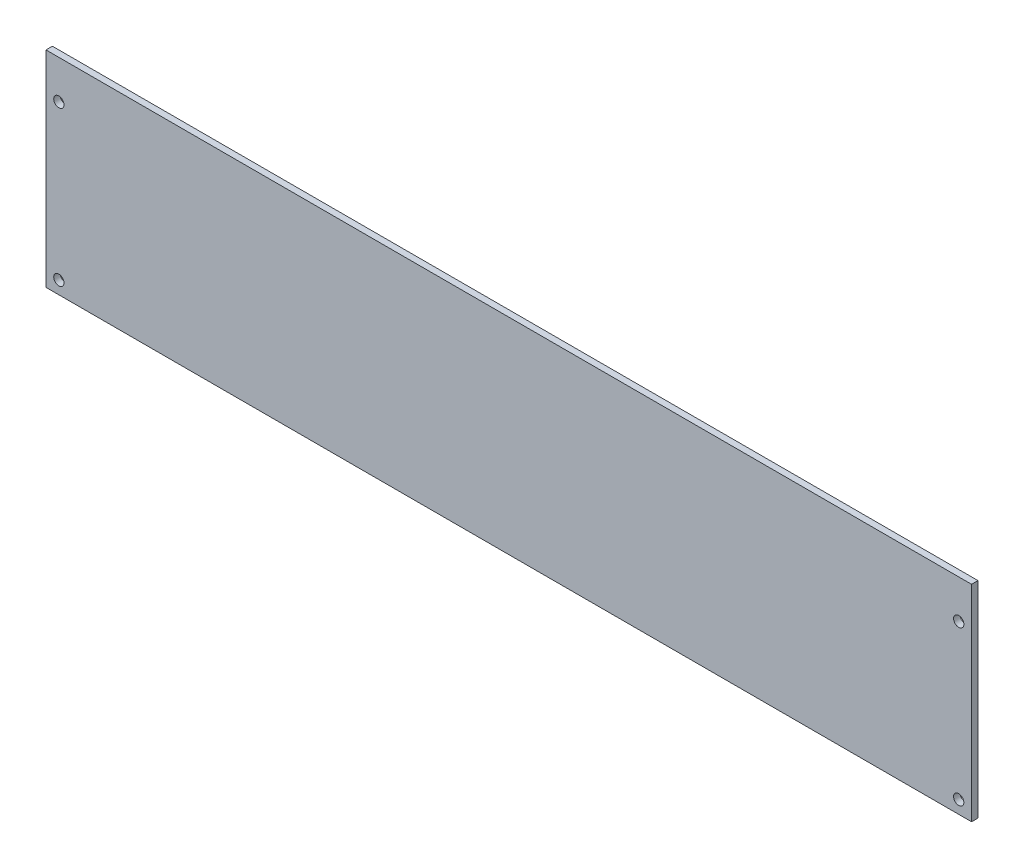
ISO-10303-21;
HEADER;
FILE_DESCRIPTION(('STEP AP214'),'2;1');
FILE_NAME('part.step','',(''),(''),'','','');
FILE_SCHEMA(('AUTOMOTIVE_DESIGN { 1 0 10303 214 1 1 1 1 }'));
ENDSEC;
DATA;
#1=APPLICATION_CONTEXT('core data for automotive mechanical design processes');
#2=APPLICATION_PROTOCOL_DEFINITION('international standard','automotive_design',2000,#1);
#3=PRODUCT_CONTEXT('',#1,'mechanical');
#4=PRODUCT('Part','Part','',(#3));
#5=PRODUCT_RELATED_PRODUCT_CATEGORY('part','',(#4));
#6=PRODUCT_DEFINITION_FORMATION('','',#4);
#7=PRODUCT_DEFINITION_CONTEXT('part definition',#1,'design');
#8=PRODUCT_DEFINITION('design','',#6,#7);
#9=PRODUCT_DEFINITION_SHAPE('','',#8);
#10=(LENGTH_UNIT() NAMED_UNIT(*) SI_UNIT(.MILLI.,.METRE.));
#11=(NAMED_UNIT(*) PLANE_ANGLE_UNIT() SI_UNIT($,.RADIAN.));
#12=(NAMED_UNIT(*) SI_UNIT($,.STERADIAN.) SOLID_ANGLE_UNIT());
#13=UNCERTAINTY_MEASURE_WITH_UNIT(LENGTH_MEASURE(1.E-05),#10,'distance_accuracy_value','');
#14=(GEOMETRIC_REPRESENTATION_CONTEXT(3) GLOBAL_UNCERTAINTY_ASSIGNED_CONTEXT((#13)) GLOBAL_UNIT_ASSIGNED_CONTEXT((#10,
#11,#12)) REPRESENTATION_CONTEXT('',''));
#15=CARTESIAN_POINT('',(0.,0.,0.));
#16=DIRECTION('',(0.,0.,1.));
#17=DIRECTION('',(1.,0.,0.));
#18=AXIS2_PLACEMENT_3D('',#15,#16,#17);
#19=CARTESIAN_POINT('',(-381.526970954357,85.3319397027155,-3.175));
#20=DIRECTION('',(-1.,0.,0.));
#21=DIRECTION('',(0.,0.,1.));
#22=AXIS2_PLACEMENT_3D('',#19,#20,#21);
#23=PLANE('',#22);
#24=DIRECTION('',(0.,-1.,0.));
#25=VECTOR('',#24,1.);
#26=CARTESIAN_POINT('',(-381.526970954357,85.3319397027155,0.));
#27=LINE('',#26,#25);
#28=CARTESIAN_POINT('',(-381.526970954357,85.3319397027155,0.));
#29=VERTEX_POINT('',#28);
#30=CARTESIAN_POINT('',(-381.526970954357,-16.2680602972845,0.));
#31=VERTEX_POINT('',#30);
#32=EDGE_CURVE('E98',#29,#31,#27,.T.);
#33=ORIENTED_EDGE('',*,*,#32,.F.);
#34=DIRECTION('',(0.,0.,1.));
#35=VECTOR('',#34,1.);
#36=CARTESIAN_POINT('',(-381.526970954357,85.3319397027155,-3.175));
#37=LINE('',#36,#35);
#38=CARTESIAN_POINT('',(-381.526970954357,85.3319397027155,-3.175));
#39=VERTEX_POINT('',#38);
#40=EDGE_CURVE('E11',#39,#29,#37,.T.);
#41=ORIENTED_EDGE('',*,*,#40,.F.);
#42=DIRECTION('',(0.,-1.,0.));
#43=VECTOR('',#42,1.);
#44=CARTESIAN_POINT('',(-381.526970954357,85.3319397027155,-3.175));
#45=LINE('',#44,#43);
#46=CARTESIAN_POINT('',(-381.526970954357,-16.2680602972845,-3.175));
#47=VERTEX_POINT('',#46);
#48=EDGE_CURVE('E91',#39,#47,#45,.T.);
#49=ORIENTED_EDGE('',*,*,#48,.T.);
#50=DIRECTION('',(0.,0.,1.));
#51=VECTOR('',#50,1.);
#52=CARTESIAN_POINT('',(-381.526970954357,-16.2680602972845,-3.175));
#53=LINE('',#52,#51);
#54=EDGE_CURVE('E36',#47,#31,#53,.T.);
#55=ORIENTED_EDGE('',*,*,#54,.T.);
#56=EDGE_LOOP('',(#33,#41,#49,#55));
#57=FACE_BOUND('',#56,.T.);
#58=ADVANCED_FACE('F33',(#57),#23,.T.);
#59=CARTESIAN_POINT('',(-381.526970954357,85.3319397027155,-3.175));
#60=DIRECTION('',(0.,1.,0.));
#61=DIRECTION('',(0.,0.,1.));
#62=AXIS2_PLACEMENT_3D('',#59,#60,#61);
#63=PLANE('',#62);
#64=DIRECTION('',(-1.,0.,0.));
#65=VECTOR('',#64,1.);
#66=CARTESIAN_POINT('',(-381.526970954357,85.3319397027155,0.));
#67=LINE('',#66,#65);
#68=CARTESIAN_POINT('',(75.6730290456432,85.3319397027155,0.));
#69=VERTEX_POINT('',#68);
#70=EDGE_CURVE('E93',#69,#29,#67,.T.);
#71=ORIENTED_EDGE('',*,*,#70,.F.);
#72=DIRECTION('',(0.,0.,1.));
#73=VECTOR('',#72,1.);
#74=CARTESIAN_POINT('',(75.6730290456432,85.3319397027155,-3.175));
#75=LINE('',#74,#73);
#76=CARTESIAN_POINT('',(75.6730290456432,85.3319397027155,-3.175));
#77=VERTEX_POINT('',#76);
#78=EDGE_CURVE('E42',#77,#69,#75,.T.);
#79=ORIENTED_EDGE('',*,*,#78,.F.);
#80=DIRECTION('',(-1.,0.,0.));
#81=VECTOR('',#80,1.);
#82=CARTESIAN_POINT('',(-381.526970954357,85.3319397027155,-3.175));
#83=LINE('',#82,#81);
#84=EDGE_CURVE('E88',#77,#39,#83,.T.);
#85=ORIENTED_EDGE('',*,*,#84,.T.);
#86=ORIENTED_EDGE('',*,*,#40,.T.);
#87=EDGE_LOOP('',(#71,#79,#85,#86));
#88=FACE_BOUND('',#87,.T.);
#89=ADVANCED_FACE('F109',(#88),#63,.T.);
#90=CARTESIAN_POINT('',(75.6730290456432,85.3319397027155,-3.175));
#91=DIRECTION('',(1.,0.,0.));
#92=DIRECTION('',(0.,1.,0.));
#93=AXIS2_PLACEMENT_3D('',#90,#91,#92);
#94=PLANE('',#93);
#95=DIRECTION('',(0.,1.,0.));
#96=VECTOR('',#95,1.);
#97=CARTESIAN_POINT('',(75.6730290456432,85.3319397027155,0.));
#98=LINE('',#97,#96);
#99=CARTESIAN_POINT('',(75.6730290456432,-16.2680602972845,0.));
#100=VERTEX_POINT('',#99);
#101=EDGE_CURVE('E83',#100,#69,#98,.T.);
#102=ORIENTED_EDGE('',*,*,#101,.F.);
#103=DIRECTION('',(0.,0.,1.));
#104=VECTOR('',#103,1.);
#105=CARTESIAN_POINT('',(75.6730290456432,-16.2680602972845,-3.175));
#106=LINE('',#105,#104);
#107=CARTESIAN_POINT('',(75.6730290456432,-16.2680602972845,-3.175));
#108=VERTEX_POINT('',#107);
#109=EDGE_CURVE('E78',#108,#100,#106,.T.);
#110=ORIENTED_EDGE('',*,*,#109,.F.);
#111=DIRECTION('',(0.,1.,0.));
#112=VECTOR('',#111,1.);
#113=CARTESIAN_POINT('',(75.6730290456432,85.3319397027155,-3.175));
#114=LINE('',#113,#112);
#115=EDGE_CURVE('E81',#108,#77,#114,.T.);
#116=ORIENTED_EDGE('',*,*,#115,.T.);
#117=ORIENTED_EDGE('',*,*,#78,.T.);
#118=EDGE_LOOP('',(#102,#110,#116,#117));
#119=FACE_BOUND('',#118,.T.);
#120=ADVANCED_FACE('F80',(#119),#94,.T.);
#121=CARTESIAN_POINT('',(-381.526970954357,-16.2680602972845,-3.175));
#122=DIRECTION('',(0.,-1.,0.));
#123=DIRECTION('',(0.,0.,-1.));
#124=AXIS2_PLACEMENT_3D('',#121,#122,#123);
#125=PLANE('',#124);
#126=DIRECTION('',(1.,0.,0.));
#127=VECTOR('',#126,1.);
#128=CARTESIAN_POINT('',(-381.526970954357,-16.2680602972845,0.));
#129=LINE('',#128,#127);
#130=EDGE_CURVE('E101',#31,#100,#129,.T.);
#131=ORIENTED_EDGE('',*,*,#130,.F.);
#132=ORIENTED_EDGE('',*,*,#54,.F.);
#133=DIRECTION('',(1.,0.,0.));
#134=VECTOR('',#133,1.);
#135=CARTESIAN_POINT('',(-381.526970954357,-16.2680602972845,-3.175));
#136=LINE('',#135,#134);
#137=EDGE_CURVE('E87',#47,#108,#136,.T.);
#138=ORIENTED_EDGE('',*,*,#137,.T.);
#139=ORIENTED_EDGE('',*,*,#109,.T.);
#140=EDGE_LOOP('',(#131,#132,#138,#139));
#141=FACE_BOUND('',#140,.T.);
#142=ADVANCED_FACE('F90',(#141),#125,.T.);
#143=CARTESIAN_POINT('',(-381.526970954357,-16.2680602972845,-3.175));
#144=DIRECTION('',(0.,0.,1.));
#145=DIRECTION('',(1.,0.,0.));
#146=AXIS2_PLACEMENT_3D('',#143,#144,#145);
#147=PLANE('',#146);
#148=CARTESIAN_POINT('',(69.3230290456432,-9.91806029728452,-3.175));
#149=DIRECTION('',(0.,0.,1.));
#150=DIRECTION('',(1.,0.,0.));
#151=AXIS2_PLACEMENT_3D('',#148,#149,#150);
#152=CIRCLE('',#151,2.54);
#153=CARTESIAN_POINT('',(71.8630290456432,-9.91806029728452,-3.175));
#154=VERTEX_POINT('',#153);
#155=EDGE_CURVE('E150',#154,#154,#152,.T.);
#156=ORIENTED_EDGE('',*,*,#155,.T.);
#157=EDGE_LOOP('',(#156));
#158=FACE_BOUND('',#157,.T.);
#159=CARTESIAN_POINT('',(69.3230290456432,66.2819397027155,-3.175));
#160=DIRECTION('',(0.,0.,1.));
#161=DIRECTION('',(1.,0.,0.));
#162=AXIS2_PLACEMENT_3D('',#159,#160,#161);
#163=CIRCLE('',#162,2.53999999999999);
#164=CARTESIAN_POINT('',(71.8630290456432,66.2819397027155,-3.175));
#165=VERTEX_POINT('',#164);
#166=EDGE_CURVE('E158',#165,#165,#163,.T.);
#167=ORIENTED_EDGE('',*,*,#166,.T.);
#168=EDGE_LOOP('',(#167));
#169=FACE_BOUND('',#168,.T.);
#170=CARTESIAN_POINT('',(-375.176970954357,-9.91806029728452,-3.175));
#171=DIRECTION('',(0.,0.,1.));
#172=DIRECTION('',(1.,0.,0.));
#173=AXIS2_PLACEMENT_3D('',#170,#171,#172);
#174=CIRCLE('',#173,2.54000000000001);
#175=CARTESIAN_POINT('',(-372.636970954357,-9.91806029728452,-3.175));
#176=VERTEX_POINT('',#175);
#177=EDGE_CURVE('E164',#176,#176,#174,.T.);
#178=ORIENTED_EDGE('',*,*,#177,.T.);
#179=EDGE_LOOP('',(#178));
#180=FACE_BOUND('',#179,.T.);
#181=CARTESIAN_POINT('',(-375.176970954357,66.2819397027155,-3.175));
#182=DIRECTION('',(0.,0.,1.));
#183=DIRECTION('',(1.,0.,0.));
#184=AXIS2_PLACEMENT_3D('',#181,#182,#183);
#185=CIRCLE('',#184,2.54000000000001);
#186=CARTESIAN_POINT('',(-372.636970954357,66.2819397027155,-3.175));
#187=VERTEX_POINT('',#186);
#188=EDGE_CURVE('E102',#187,#187,#185,.T.);
#189=ORIENTED_EDGE('',*,*,#188,.T.);
#190=EDGE_LOOP('',(#189));
#191=FACE_BOUND('',#190,.T.);
#192=ORIENTED_EDGE('',*,*,#48,.F.);
#193=ORIENTED_EDGE('',*,*,#84,.F.);
#194=ORIENTED_EDGE('',*,*,#115,.F.);
#195=ORIENTED_EDGE('',*,*,#137,.F.);
#196=EDGE_LOOP('',(#192,#193,#194,#195));
#197=FACE_BOUND('',#196,.T.);
#198=ADVANCED_FACE('F86',(#158,#169,#180,#191,#197),#147,.F.);
#199=CARTESIAN_POINT('',(-381.526970954357,-16.2680602972845,0.));
#200=DIRECTION('',(0.,0.,1.));
#201=DIRECTION('',(1.,0.,0.));
#202=AXIS2_PLACEMENT_3D('',#199,#200,#201);
#203=PLANE('',#202);
#204=CARTESIAN_POINT('',(69.3230290456432,-9.91806029728452,0.));
#205=DIRECTION('',(0.,0.,1.));
#206=DIRECTION('',(1.,0.,0.));
#207=AXIS2_PLACEMENT_3D('',#204,#205,#206);
#208=CIRCLE('',#207,2.54);
#209=CARTESIAN_POINT('',(71.8630290456432,-9.91806029728452,0.));
#210=VERTEX_POINT('',#209);
#211=EDGE_CURVE('E153',#210,#210,#208,.T.);
#212=ORIENTED_EDGE('',*,*,#211,.F.);
#213=EDGE_LOOP('',(#212));
#214=FACE_BOUND('',#213,.T.);
#215=CARTESIAN_POINT('',(69.3230290456432,66.2819397027155,0.));
#216=DIRECTION('',(0.,0.,1.));
#217=DIRECTION('',(1.,0.,0.));
#218=AXIS2_PLACEMENT_3D('',#215,#216,#217);
#219=CIRCLE('',#218,2.53999999999999);
#220=CARTESIAN_POINT('',(71.8630290456432,66.2819397027155,0.));
#221=VERTEX_POINT('',#220);
#222=EDGE_CURVE('E155',#221,#221,#219,.T.);
#223=ORIENTED_EDGE('',*,*,#222,.F.);
#224=EDGE_LOOP('',(#223));
#225=FACE_BOUND('',#224,.T.);
#226=CARTESIAN_POINT('',(-375.176970954357,-9.91806029728452,0.));
#227=DIRECTION('',(0.,0.,1.));
#228=DIRECTION('',(1.,0.,0.));
#229=AXIS2_PLACEMENT_3D('',#226,#227,#228);
#230=CIRCLE('',#229,2.54000000000001);
#231=CARTESIAN_POINT('',(-372.636970954357,-9.91806029728452,0.));
#232=VERTEX_POINT('',#231);
#233=EDGE_CURVE('E161',#232,#232,#230,.T.);
#234=ORIENTED_EDGE('',*,*,#233,.F.);
#235=EDGE_LOOP('',(#234));
#236=FACE_BOUND('',#235,.T.);
#237=CARTESIAN_POINT('',(-375.176970954357,66.2819397027155,0.));
#238=DIRECTION('',(0.,0.,1.));
#239=DIRECTION('',(1.,0.,0.));
#240=AXIS2_PLACEMENT_3D('',#237,#238,#239);
#241=CIRCLE('',#240,2.54000000000001);
#242=CARTESIAN_POINT('',(-372.636970954357,66.2819397027155,0.));
#243=VERTEX_POINT('',#242);
#244=EDGE_CURVE('E167',#243,#243,#241,.T.);
#245=ORIENTED_EDGE('',*,*,#244,.F.);
#246=EDGE_LOOP('',(#245));
#247=FACE_BOUND('',#246,.T.);
#248=ORIENTED_EDGE('',*,*,#32,.T.);
#249=ORIENTED_EDGE('',*,*,#130,.T.);
#250=ORIENTED_EDGE('',*,*,#101,.T.);
#251=ORIENTED_EDGE('',*,*,#70,.T.);
#252=EDGE_LOOP('',(#248,#249,#250,#251));
#253=FACE_BOUND('',#252,.T.);
#254=ADVANCED_FACE('F108',(#214,#225,#236,#247,#253),#203,.T.);
#255=CARTESIAN_POINT('',(-375.176970954357,66.2819397027155,-3.175));
#256=DIRECTION('',(0.,0.,1.));
#257=DIRECTION('',(1.,0.,0.));
#258=AXIS2_PLACEMENT_3D('',#255,#256,#257);
#259=CYLINDRICAL_SURFACE('',#258,2.54000000000001);
#260=ORIENTED_EDGE('',*,*,#188,.F.);
#261=EDGE_LOOP('',(#260));
#262=FACE_BOUND('',#261,.T.);
#263=ORIENTED_EDGE('',*,*,#244,.T.);
#264=EDGE_LOOP('',(#263));
#265=FACE_BOUND('',#264,.T.);
#266=ADVANCED_FACE('F127',(#262,#265),#259,.F.);
#267=CARTESIAN_POINT('',(-375.176970954357,-9.91806029728452,-3.175));
#268=DIRECTION('',(0.,0.,1.));
#269=DIRECTION('',(1.,0.,0.));
#270=AXIS2_PLACEMENT_3D('',#267,#268,#269);
#271=CYLINDRICAL_SURFACE('',#270,2.54000000000001);
#272=ORIENTED_EDGE('',*,*,#177,.F.);
#273=EDGE_LOOP('',(#272));
#274=FACE_BOUND('',#273,.T.);
#275=ORIENTED_EDGE('',*,*,#233,.T.);
#276=EDGE_LOOP('',(#275));
#277=FACE_BOUND('',#276,.T.);
#278=ADVANCED_FACE('F134',(#274,#277),#271,.F.);
#279=CARTESIAN_POINT('',(69.3230290456432,66.2819397027155,-3.175));
#280=DIRECTION('',(0.,0.,1.));
#281=DIRECTION('',(1.,0.,0.));
#282=AXIS2_PLACEMENT_3D('',#279,#280,#281);
#283=CYLINDRICAL_SURFACE('',#282,2.53999999999999);
#284=ORIENTED_EDGE('',*,*,#166,.F.);
#285=EDGE_LOOP('',(#284));
#286=FACE_BOUND('',#285,.T.);
#287=ORIENTED_EDGE('',*,*,#222,.T.);
#288=EDGE_LOOP('',(#287));
#289=FACE_BOUND('',#288,.T.);
#290=ADVANCED_FACE('F138',(#286,#289),#283,.F.);
#291=CARTESIAN_POINT('',(69.3230290456432,-9.91806029728452,-3.175));
#292=DIRECTION('',(0.,0.,1.));
#293=DIRECTION('',(1.,0.,0.));
#294=AXIS2_PLACEMENT_3D('',#291,#292,#293);
#295=CYLINDRICAL_SURFACE('',#294,2.54);
#296=ORIENTED_EDGE('',*,*,#155,.F.);
#297=EDGE_LOOP('',(#296));
#298=FACE_BOUND('',#297,.T.);
#299=ORIENTED_EDGE('',*,*,#211,.T.);
#300=EDGE_LOOP('',(#299));
#301=FACE_BOUND('',#300,.T.);
#302=ADVANCED_FACE('F142',(#298,#301),#295,.F.);
#303=CLOSED_SHELL('',(#58,#89,#120,#142,#198,#254,#266,#278,#290,#302));
#304=MANIFOLD_SOLID_BREP('B2',#303);
#305=ADVANCED_BREP_SHAPE_REPRESENTATION('',(#18,#304),#14);
#306=SHAPE_DEFINITION_REPRESENTATION(#9,#305);
ENDSEC;
END-ISO-10303-21;
